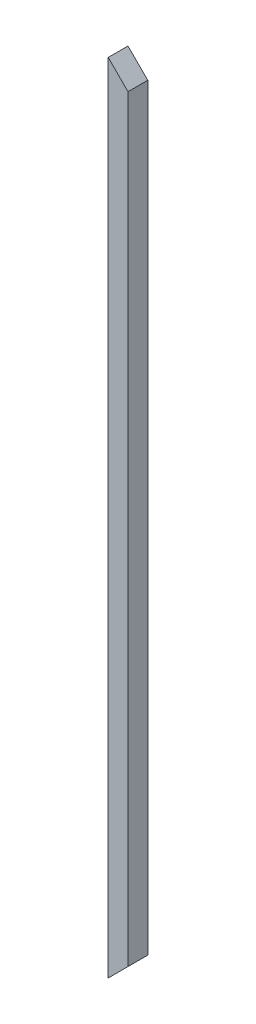
ISO-10303-21;
HEADER;
FILE_DESCRIPTION(('STEP AP214'),'2;1');
FILE_NAME('part.step','',(''),(''),'','','');
FILE_SCHEMA(('AUTOMOTIVE_DESIGN { 1 0 10303 214 1 1 1 1 }'));
ENDSEC;
DATA;
#1=APPLICATION_CONTEXT('core data for automotive mechanical design processes');
#2=APPLICATION_PROTOCOL_DEFINITION('international standard','automotive_design',2000,#1);
#3=PRODUCT_CONTEXT('',#1,'mechanical');
#4=PRODUCT('Part','Part','',(#3));
#5=PRODUCT_RELATED_PRODUCT_CATEGORY('part','',(#4));
#6=PRODUCT_DEFINITION_FORMATION('','',#4);
#7=PRODUCT_DEFINITION_CONTEXT('part definition',#1,'design');
#8=PRODUCT_DEFINITION('design','',#6,#7);
#9=PRODUCT_DEFINITION_SHAPE('','',#8);
#10=(LENGTH_UNIT() NAMED_UNIT(*) SI_UNIT(.MILLI.,.METRE.));
#11=(NAMED_UNIT(*) PLANE_ANGLE_UNIT() SI_UNIT($,.RADIAN.));
#12=(NAMED_UNIT(*) SI_UNIT($,.STERADIAN.) SOLID_ANGLE_UNIT());
#13=UNCERTAINTY_MEASURE_WITH_UNIT(LENGTH_MEASURE(1.E-05),#10,'distance_accuracy_value','');
#14=(GEOMETRIC_REPRESENTATION_CONTEXT(3) GLOBAL_UNCERTAINTY_ASSIGNED_CONTEXT((#13)) GLOBAL_UNIT_ASSIGNED_CONTEXT((#10,
#11,#12)) REPRESENTATION_CONTEXT('',''));
#15=CARTESIAN_POINT('',(0.,0.,0.));
#16=DIRECTION('',(0.,0.,1.));
#17=DIRECTION('',(1.,0.,0.));
#18=AXIS2_PLACEMENT_3D('',#15,#16,#17);
#19=CARTESIAN_POINT('',(-25.,2015.25,-25.));
#20=DIRECTION('',(1.,0.,0.));
#21=DIRECTION('',(0.,0.,-1.));
#22=AXIS2_PLACEMENT_3D('',#19,#20,#21);
#23=PLANE('',#22);
#24=DIRECTION('',(0.,0.,1.));
#25=VECTOR('',#24,1.);
#26=CARTESIAN_POINT('',(-25.,0.,-25.));
#27=LINE('',#26,#25);
#28=CARTESIAN_POINT('',(-25.,0.,-25.));
#29=VERTEX_POINT('',#28);
#30=CARTESIAN_POINT('',(-25.,0.,25.));
#31=VERTEX_POINT('',#30);
#32=EDGE_CURVE('E75',#29,#31,#27,.T.);
#33=ORIENTED_EDGE('',*,*,#32,.T.);
#34=DIRECTION('',(0.,-1.,0.));
#35=VECTOR('',#34,1.);
#36=CARTESIAN_POINT('',(-25.,2015.25,25.));
#37=LINE('',#36,#35);
#38=CARTESIAN_POINT('',(-25.,2015.25,24.9999999999999));
#39=VERTEX_POINT('',#38);
#40=EDGE_CURVE('E11',#39,#31,#37,.T.);
#41=ORIENTED_EDGE('',*,*,#40,.F.);
#42=DIRECTION('',(0.,0.,1.));
#43=VECTOR('',#42,1.);
#44=CARTESIAN_POINT('',(-25.,2015.25,-25.));
#45=LINE('',#44,#43);
#46=CARTESIAN_POINT('',(-25.,2015.25,-25.));
#47=VERTEX_POINT('',#46);
#48=EDGE_CURVE('E85',#47,#39,#45,.T.);
#49=ORIENTED_EDGE('',*,*,#48,.F.);
#50=DIRECTION('',(0.,-1.,0.));
#51=VECTOR('',#50,1.);
#52=CARTESIAN_POINT('',(-25.,2015.25,-25.));
#53=LINE('',#52,#51);
#54=EDGE_CURVE('E91',#47,#29,#53,.T.);
#55=ORIENTED_EDGE('',*,*,#54,.T.);
#56=EDGE_LOOP('',(#33,#41,#49,#55));
#57=FACE_BOUND('',#56,.T.);
#58=ADVANCED_FACE('F40',(#57),#23,.F.);
#59=CARTESIAN_POINT('',(25.,2015.25,25.));
#60=DIRECTION('',(0.,0.,-1.));
#61=DIRECTION('',(-1.,0.,0.));
#62=AXIS2_PLACEMENT_3D('',#59,#60,#61);
#63=PLANE('',#62);
#64=ORIENTED_EDGE('',*,*,#40,.T.);
#65=DIRECTION('',(0.707106781186551,0.707106781186544,0.));
#66=VECTOR('',#65,1.);
#67=CARTESIAN_POINT('',(1007.625,1032.62499999999,25.));
#68=LINE('',#67,#66);
#69=CARTESIAN_POINT('',(25.,49.9999999999996,24.9999999999999));
#70=VERTEX_POINT('',#69);
#71=EDGE_CURVE('E81',#31,#70,#68,.T.);
#72=ORIENTED_EDGE('',*,*,#71,.T.);
#73=DIRECTION('',(0.,-1.,0.));
#74=VECTOR('',#73,1.);
#75=CARTESIAN_POINT('',(25.,2015.25,25.));
#76=LINE('',#75,#74);
#77=CARTESIAN_POINT('',(25.,1965.25,24.9999999999999));
#78=VERTEX_POINT('',#77);
#79=EDGE_CURVE('E48',#78,#70,#76,.T.);
#80=ORIENTED_EDGE('',*,*,#79,.F.);
#81=DIRECTION('',(-0.707106781186544,0.707106781186551,0.));
#82=VECTOR('',#81,1.);
#83=CARTESIAN_POINT('',(-2.42861286636753E-13,1990.25,25.));
#84=LINE('',#83,#82);
#85=EDGE_CURVE('E86',#78,#39,#84,.T.);
#86=ORIENTED_EDGE('',*,*,#85,.T.);
#87=EDGE_LOOP('',(#64,#72,#80,#86));
#88=FACE_BOUND('',#87,.T.);
#89=ADVANCED_FACE('F108',(#88),#63,.F.);
#90=CARTESIAN_POINT('',(25.,2015.25,-25.));
#91=DIRECTION('',(-1.,0.,0.));
#92=DIRECTION('',(0.,0.,1.));
#93=AXIS2_PLACEMENT_3D('',#90,#91,#92);
#94=PLANE('',#93);
#95=ORIENTED_EDGE('',*,*,#79,.T.);
#96=DIRECTION('',(0.,0.,-1.));
#97=VECTOR('',#96,1.);
#98=CARTESIAN_POINT('',(25.,49.9999999999996,2975.));
#99=LINE('',#98,#97);
#100=CARTESIAN_POINT('',(25.,49.9999999999996,-25.));
#101=VERTEX_POINT('',#100);
#102=EDGE_CURVE('E95',#70,#101,#99,.T.);
#103=ORIENTED_EDGE('',*,*,#102,.T.);
#104=DIRECTION('',(0.,-1.,0.));
#105=VECTOR('',#104,1.);
#106=CARTESIAN_POINT('',(25.,2015.25,-25.));
#107=LINE('',#106,#105);
#108=CARTESIAN_POINT('',(25.,1965.25,-25.));
#109=VERTEX_POINT('',#108);
#110=EDGE_CURVE('E94',#109,#101,#107,.T.);
#111=ORIENTED_EDGE('',*,*,#110,.F.);
#112=DIRECTION('',(0.,0.,-1.));
#113=VECTOR('',#112,1.);
#114=CARTESIAN_POINT('',(25.,1965.25,2975.));
#115=LINE('',#114,#113);
#116=EDGE_CURVE('E105',#78,#109,#115,.T.);
#117=ORIENTED_EDGE('',*,*,#116,.F.);
#118=EDGE_LOOP('',(#95,#103,#111,#117));
#119=FACE_BOUND('',#118,.T.);
#120=ADVANCED_FACE('F104',(#119),#94,.F.);
#121=CARTESIAN_POINT('',(25.,2015.25,-25.));
#122=DIRECTION('',(0.,0.,1.));
#123=DIRECTION('',(1.,0.,0.));
#124=AXIS2_PLACEMENT_3D('',#121,#122,#123);
#125=PLANE('',#124);
#126=ORIENTED_EDGE('',*,*,#110,.T.);
#127=DIRECTION('',(0.707106781186551,0.707106781186544,0.));
#128=VECTOR('',#127,1.);
#129=CARTESIAN_POINT('',(-25.,0.,-25.));
#130=LINE('',#129,#128);
#131=EDGE_CURVE('E78',#29,#101,#130,.T.);
#132=ORIENTED_EDGE('',*,*,#131,.F.);
#133=ORIENTED_EDGE('',*,*,#54,.F.);
#134=DIRECTION('',(-0.707106781186544,0.707106781186551,0.));
#135=VECTOR('',#134,1.);
#136=CARTESIAN_POINT('',(-25.,2015.25,-25.));
#137=LINE('',#136,#135);
#138=EDGE_CURVE('E54',#109,#47,#137,.T.);
#139=ORIENTED_EDGE('',*,*,#138,.F.);
#140=EDGE_LOOP('',(#126,#132,#133,#139));
#141=FACE_BOUND('',#140,.T.);
#142=ADVANCED_FACE('F90',(#141),#125,.F.);
#143=CARTESIAN_POINT('',(-25.,0.,2975.));
#144=DIRECTION('',(-0.707106781186544,0.707106781186551,0.));
#145=DIRECTION('',(-0.707106781186551,-0.707106781186544,0.));
#146=AXIS2_PLACEMENT_3D('',#143,#144,#145);
#147=PLANE('',#146);
#148=ORIENTED_EDGE('',*,*,#32,.F.);
#149=ORIENTED_EDGE('',*,*,#131,.T.);
#150=ORIENTED_EDGE('',*,*,#102,.F.);
#151=ORIENTED_EDGE('',*,*,#71,.F.);
#152=EDGE_LOOP('',(#148,#149,#150,#151));
#153=FACE_BOUND('',#152,.T.);
#154=ADVANCED_FACE('F77',(#153),#147,.F.);
#155=CARTESIAN_POINT('',(-25.,2015.25,2975.));
#156=DIRECTION('',(-0.707106781186551,-0.707106781186544,0.));
#157=DIRECTION('',(0.707106781186544,-0.707106781186551,0.));
#158=AXIS2_PLACEMENT_3D('',#155,#156,#157);
#159=PLANE('',#158);
#160=ORIENTED_EDGE('',*,*,#116,.T.);
#161=ORIENTED_EDGE('',*,*,#138,.T.);
#162=ORIENTED_EDGE('',*,*,#48,.T.);
#163=ORIENTED_EDGE('',*,*,#85,.F.);
#164=EDGE_LOOP('',(#160,#161,#162,#163));
#165=FACE_BOUND('',#164,.T.);
#166=ADVANCED_FACE('F114',(#165),#159,.F.);
#167=CLOSED_SHELL('',(#58,#89,#120,#142,#154,#166));
#168=MANIFOLD_SOLID_BREP('B2',#167);
#169=ADVANCED_BREP_SHAPE_REPRESENTATION('',(#18,#168),#14);
#170=SHAPE_DEFINITION_REPRESENTATION(#9,#169);
ENDSEC;
END-ISO-10303-21;
